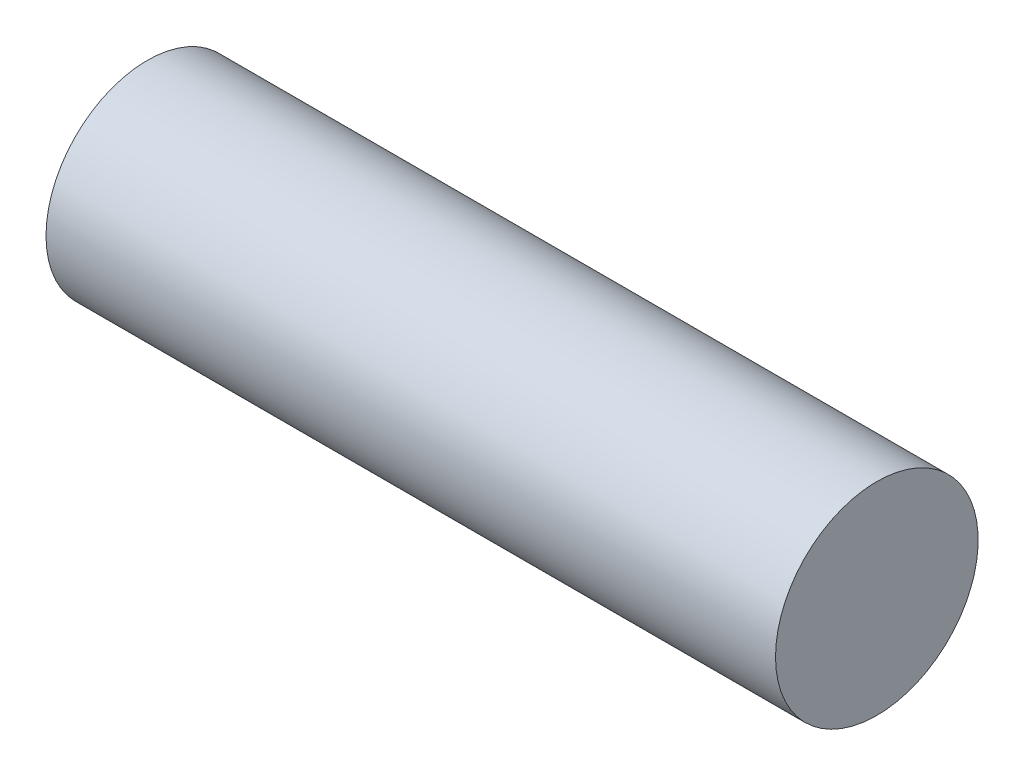
ISO-10303-21;
HEADER;
FILE_DESCRIPTION(('STEP AP214'),'2;1');
FILE_NAME('part.step','',(''),(''),'','','');
FILE_SCHEMA(('AUTOMOTIVE_DESIGN { 1 0 10303 214 1 1 1 1 }'));
ENDSEC;
DATA;
#1=APPLICATION_CONTEXT('core data for automotive mechanical design processes');
#2=APPLICATION_PROTOCOL_DEFINITION('international standard','automotive_design',2000,#1);
#3=PRODUCT_CONTEXT('',#1,'mechanical');
#4=PRODUCT('Part','Part','',(#3));
#5=PRODUCT_RELATED_PRODUCT_CATEGORY('part','',(#4));
#6=PRODUCT_DEFINITION_FORMATION('','',#4);
#7=PRODUCT_DEFINITION_CONTEXT('part definition',#1,'design');
#8=PRODUCT_DEFINITION('design','',#6,#7);
#9=PRODUCT_DEFINITION_SHAPE('','',#8);
#10=(LENGTH_UNIT() NAMED_UNIT(*) SI_UNIT(.MILLI.,.METRE.));
#11=(NAMED_UNIT(*) PLANE_ANGLE_UNIT() SI_UNIT($,.RADIAN.));
#12=(NAMED_UNIT(*) SI_UNIT($,.STERADIAN.) SOLID_ANGLE_UNIT());
#13=UNCERTAINTY_MEASURE_WITH_UNIT(LENGTH_MEASURE(1.E-05),#10,'distance_accuracy_value','');
#14=(GEOMETRIC_REPRESENTATION_CONTEXT(3) GLOBAL_UNCERTAINTY_ASSIGNED_CONTEXT((#13)) GLOBAL_UNIT_ASSIGNED_CONTEXT((#10,
#11,#12)) REPRESENTATION_CONTEXT('',''));
#15=CARTESIAN_POINT('',(0.,0.,0.));
#16=DIRECTION('',(0.,0.,1.));
#17=DIRECTION('',(1.,0.,0.));
#18=AXIS2_PLACEMENT_3D('',#15,#16,#17);
#19=CARTESIAN_POINT('',(45.,0.,0.));
#20=DIRECTION('',(-1.,0.,0.));
#21=DIRECTION('',(0.,0.,1.));
#22=AXIS2_PLACEMENT_3D('',#19,#20,#21);
#23=CYLINDRICAL_SURFACE('',#22,6.25);
#24=CARTESIAN_POINT('',(45.,0.,0.));
#25=DIRECTION('',(1.,0.,0.));
#26=DIRECTION('',(0.,0.,-1.));
#27=AXIS2_PLACEMENT_3D('',#24,#25,#26);
#28=CIRCLE('',#27,6.25);
#29=CARTESIAN_POINT('',(45.,0.,6.25));
#30=VERTEX_POINT('',#29);
#31=EDGE_CURVE('E10',#30,#30,#28,.T.);
#32=CARTESIAN_POINT('',(0.,0.,0.));
#33=DIRECTION('',(1.,0.,0.));
#34=DIRECTION('',(0.,0.,-1.));
#35=AXIS2_PLACEMENT_3D('',#32,#33,#34);
#36=CIRCLE('',#35,6.25);
#37=CARTESIAN_POINT('',(0.,0.,6.25));
#38=VERTEX_POINT('',#37);
#39=EDGE_CURVE('E31',#38,#38,#36,.T.);
#40=CARTESIAN_POINT('',(45.,0.,6.25));
#41=CARTESIAN_POINT('',(44.53125,0.,6.25));
#42=CARTESIAN_POINT('',(44.0625,0.,6.25));
#43=CARTESIAN_POINT('',(43.125,0.,6.25));
#44=CARTESIAN_POINT('',(42.65625,0.,6.25));
#45=CARTESIAN_POINT('',(41.71875,0.,6.25));
#46=CARTESIAN_POINT('',(41.25,0.,6.25));
#47=CARTESIAN_POINT('',(40.3125,0.,6.25));
#48=CARTESIAN_POINT('',(39.84375,0.,6.25));
#49=CARTESIAN_POINT('',(38.90625,0.,6.25));
#50=CARTESIAN_POINT('',(38.4375,0.,6.25));
#51=CARTESIAN_POINT('',(37.5,0.,6.25));
#52=CARTESIAN_POINT('',(37.03125,0.,6.25));
#53=CARTESIAN_POINT('',(36.09375,0.,6.25));
#54=CARTESIAN_POINT('',(35.625,0.,6.25));
#55=CARTESIAN_POINT('',(34.6875,0.,6.25));
#56=CARTESIAN_POINT('',(34.21875,0.,6.25));
#57=CARTESIAN_POINT('',(33.28125,0.,6.25));
#58=CARTESIAN_POINT('',(32.8125,0.,6.25));
#59=CARTESIAN_POINT('',(31.875,0.,6.25));
#60=CARTESIAN_POINT('',(31.40625,0.,6.25));
#61=CARTESIAN_POINT('',(30.46875,0.,6.25));
#62=CARTESIAN_POINT('',(30.,0.,6.25));
#63=CARTESIAN_POINT('',(29.0625,0.,6.25));
#64=CARTESIAN_POINT('',(28.59375,0.,6.25));
#65=CARTESIAN_POINT('',(27.65625,0.,6.25));
#66=CARTESIAN_POINT('',(27.1875,0.,6.25));
#67=CARTESIAN_POINT('',(26.25,0.,6.25));
#68=CARTESIAN_POINT('',(25.78125,0.,6.25));
#69=CARTESIAN_POINT('',(24.84375,0.,6.25));
#70=CARTESIAN_POINT('',(24.375,0.,6.25));
#71=CARTESIAN_POINT('',(23.4375,0.,6.25));
#72=CARTESIAN_POINT('',(22.96875,0.,6.25));
#73=CARTESIAN_POINT('',(22.03125,0.,6.25));
#74=CARTESIAN_POINT('',(21.5625,0.,6.25));
#75=CARTESIAN_POINT('',(20.625,0.,6.25));
#76=CARTESIAN_POINT('',(20.15625,0.,6.25));
#77=CARTESIAN_POINT('',(19.21875,0.,6.25));
#78=CARTESIAN_POINT('',(18.75,0.,6.25));
#79=CARTESIAN_POINT('',(17.8125,0.,6.25));
#80=CARTESIAN_POINT('',(17.34375,0.,6.25));
#81=CARTESIAN_POINT('',(16.40625,0.,6.25));
#82=CARTESIAN_POINT('',(15.9375,0.,6.25));
#83=CARTESIAN_POINT('',(15.,0.,6.25));
#84=CARTESIAN_POINT('',(14.53125,0.,6.25));
#85=CARTESIAN_POINT('',(13.59375,0.,6.25));
#86=CARTESIAN_POINT('',(13.125,0.,6.25));
#87=CARTESIAN_POINT('',(12.1875,0.,6.25));
#88=CARTESIAN_POINT('',(11.71875,0.,6.25));
#89=CARTESIAN_POINT('',(10.78125,0.,6.25));
#90=CARTESIAN_POINT('',(10.3125,0.,6.25));
#91=CARTESIAN_POINT('',(9.375,0.,6.25));
#92=CARTESIAN_POINT('',(8.90625,0.,6.25));
#93=CARTESIAN_POINT('',(7.96874999999999,0.,6.25));
#94=CARTESIAN_POINT('',(7.5,0.,6.25));
#95=CARTESIAN_POINT('',(6.5625,0.,6.25));
#96=CARTESIAN_POINT('',(6.09375,0.,6.25));
#97=CARTESIAN_POINT('',(5.15625,0.,6.25));
#98=CARTESIAN_POINT('',(4.68749999999999,0.,6.25));
#99=CARTESIAN_POINT('',(3.74999999999999,0.,6.25));
#100=CARTESIAN_POINT('',(3.28124999999999,0.,6.25));
#101=CARTESIAN_POINT('',(2.34374999999999,0.,6.25));
#102=CARTESIAN_POINT('',(1.87499999999999,0.,6.25));
#103=CARTESIAN_POINT('',(0.937499999999992,0.,6.25));
#104=CARTESIAN_POINT('',(0.468749999999993,0.,6.25));
#105=CARTESIAN_POINT('',(0.,0.,6.25));
#106=B_SPLINE_CURVE_WITH_KNOTS('',3,(#40,#41,#42,#43,#44,#45,#46,#47,#48,#49,#50,#51,#52,#53,
#54,#55,#56,#57,#58,#59,#60,#61,#62,#63,#64,#65,#66,#67,#68,#69,#70,#71,#72,#73,#74,#75,#76,#77,
#78,#79,#80,#81,#82,#83,#84,#85,#86,#87,#88,#89,#90,#91,#92,#93,#94,#95,#96,#97,#98,#99,#100,
#101,#102,#103,#104,#105),.UNSPECIFIED.,.F.,.F.,(4,2,2,2,2,2,2,2,2,2,2,2,2,2,2,2,2,2,2,2,2,2,2,
2,2,2,2,2,2,2,2,2,4),(0.,1.40625,2.8125,4.21875000000001,5.62500000000001,7.03125,8.4375,
9.84375000000001,11.25,12.65625,14.0625,15.46875,16.875,18.28125,19.6875,21.09375,22.5,23.90625,
25.3125,26.71875,28.125,29.53125,30.9375,32.34375,33.75,35.15625,36.5625,37.96875,39.375,
40.78125,42.1875,43.59375,45.),.UNSPECIFIED.);
#107=EDGE_CURVE('BSEAM28',#30,#38,#106,.T.);
#108=ORIENTED_EDGE('',*,*,#31,.F.);
#109=ORIENTED_EDGE('',*,*,#39,.T.);
#110=ORIENTED_EDGE('',*,*,#107,.T.);
#111=ORIENTED_EDGE('',*,*,#107,.F.);
#112=EDGE_LOOP('',(#108,#110,#109,#111));
#113=FACE_BOUND('',#112,.T.);
#114=ADVANCED_FACE('F28',(#113),#23,.T.);
#115=CARTESIAN_POINT('',(45.,0.,0.));
#116=DIRECTION('',(1.,0.,0.));
#117=DIRECTION('',(0.,0.,-1.));
#118=AXIS2_PLACEMENT_3D('',#115,#116,#117);
#119=PLANE('',#118);
#120=ORIENTED_EDGE('',*,*,#31,.T.);
#121=EDGE_LOOP('',(#120));
#122=FACE_BOUND('',#121,.T.);
#123=ADVANCED_FACE('F43',(#122),#119,.T.);
#124=CARTESIAN_POINT('',(0.,0.,0.));
#125=DIRECTION('',(1.,0.,0.));
#126=DIRECTION('',(0.,0.,-1.));
#127=AXIS2_PLACEMENT_3D('',#124,#125,#126);
#128=PLANE('',#127);
#129=ORIENTED_EDGE('',*,*,#39,.F.);
#130=EDGE_LOOP('',(#129));
#131=FACE_BOUND('',#130,.T.);
#132=ADVANCED_FACE('F41',(#131),#128,.F.);
#133=CLOSED_SHELL('',(#114,#123,#132));
#134=MANIFOLD_SOLID_BREP('B2',#133);
#135=ADVANCED_BREP_SHAPE_REPRESENTATION('',(#18,#134),#14);
#136=SHAPE_DEFINITION_REPRESENTATION(#9,#135);
ENDSEC;
END-ISO-10303-21;
